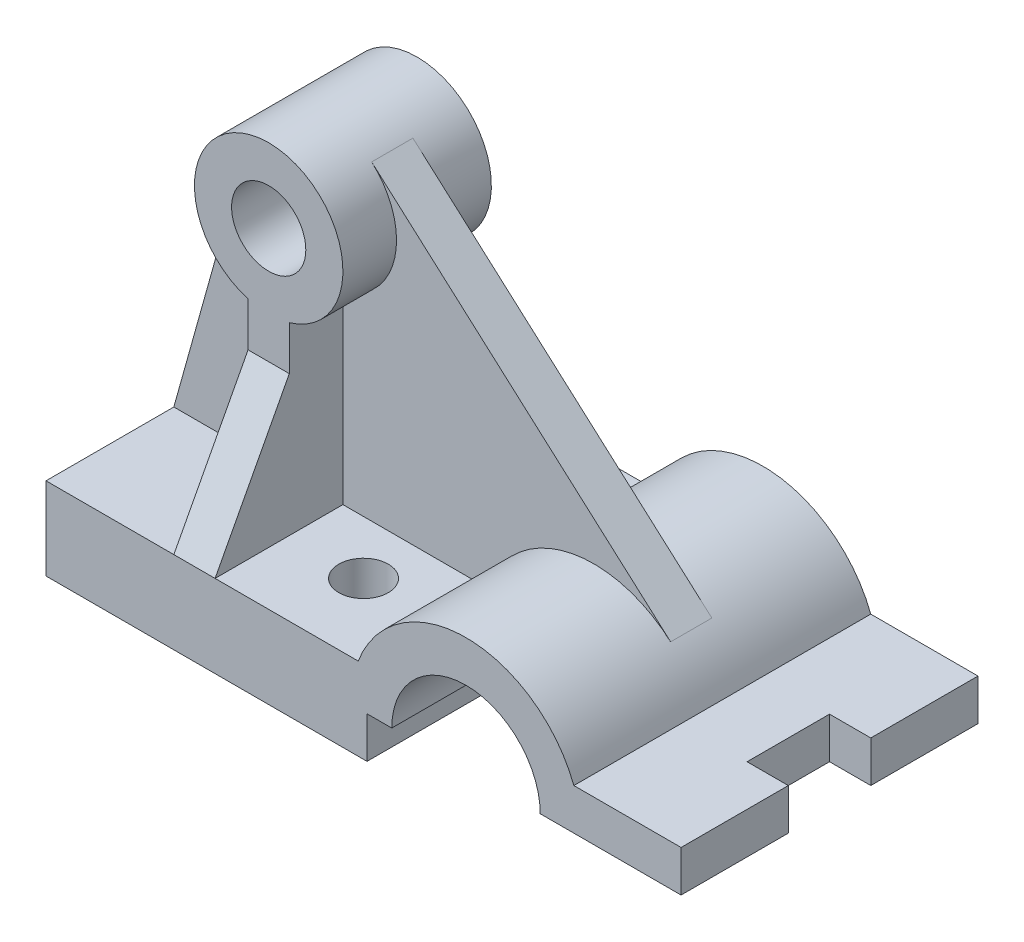
ISO-10303-21;
HEADER;
FILE_DESCRIPTION(('STEP AP214'),'2;1');
FILE_NAME('part.step','',(''),(''),'','','');
FILE_SCHEMA(('AUTOMOTIVE_DESIGN { 1 0 10303 214 1 1 1 1 }'));
ENDSEC;
DATA;
#1=APPLICATION_CONTEXT('core data for automotive mechanical design processes');
#2=APPLICATION_PROTOCOL_DEFINITION('international standard','automotive_design',2000,#1);
#3=PRODUCT_CONTEXT('',#1,'mechanical');
#4=PRODUCT('Part','Part','',(#3));
#5=PRODUCT_RELATED_PRODUCT_CATEGORY('part','',(#4));
#6=PRODUCT_DEFINITION_FORMATION('','',#4);
#7=PRODUCT_DEFINITION_CONTEXT('part definition',#1,'design');
#8=PRODUCT_DEFINITION('design','',#6,#7);
#9=PRODUCT_DEFINITION_SHAPE('','',#8);
#10=(LENGTH_UNIT() NAMED_UNIT(*) SI_UNIT(.MILLI.,.METRE.));
#11=(NAMED_UNIT(*) PLANE_ANGLE_UNIT() SI_UNIT($,.RADIAN.));
#12=(NAMED_UNIT(*) SI_UNIT($,.STERADIAN.) SOLID_ANGLE_UNIT());
#13=UNCERTAINTY_MEASURE_WITH_UNIT(LENGTH_MEASURE(1.E-05),#10,'distance_accuracy_value','');
#14=(GEOMETRIC_REPRESENTATION_CONTEXT(3) GLOBAL_UNCERTAINTY_ASSIGNED_CONTEXT((#13)) GLOBAL_UNIT_ASSIGNED_CONTEXT((#10,
#11,#12)) REPRESENTATION_CONTEXT('',''));
#15=CARTESIAN_POINT('',(0.,0.,0.));
#16=DIRECTION('',(0.,0.,1.));
#17=DIRECTION('',(1.,0.,0.));
#18=AXIS2_PLACEMENT_3D('',#15,#16,#17);
#19=CARTESIAN_POINT('',(0.,20.,-36.));
#20=DIRECTION('',(0.,1.,0.));
#21=DIRECTION('',(-1.,0.,0.));
#22=AXIS2_PLACEMENT_3D('',#19,#20,#21);
#23=PLANE('',#22);
#24=CARTESIAN_POINT('',(59.,20.,-18.));
#25=DIRECTION('',(0.,1.,0.));
#26=DIRECTION('',(1.,0.,0.));
#27=AXIS2_PLACEMENT_3D('',#24,#25,#26);
#28=CIRCLE('',#27,6.);
#29=CARTESIAN_POINT('',(65.,20.,-18.));
#30=VERTEX_POINT('',#29);
#31=EDGE_CURVE('E602',#30,#30,#28,.T.);
#32=ORIENTED_EDGE('',*,*,#31,.F.);
#33=EDGE_LOOP('',(#32));
#34=FACE_BOUND('',#33,.T.);
#35=DIRECTION('',(-1.,0.,0.));
#36=VECTOR('',#35,1.);
#37=CARTESIAN_POINT('',(0.,20.,-36.));
#38=LINE('',#37,#36);
#39=CARTESIAN_POINT('',(75.6932126775119,20.,-36.));
#40=VERTEX_POINT('',#39);
#41=CARTESIAN_POINT('',(41.,20.,-36.));
#42=VERTEX_POINT('',#41);
#43=EDGE_CURVE('E481',#40,#42,#38,.T.);
#44=ORIENTED_EDGE('',*,*,#43,.T.);
#45=DIRECTION('',(0.,0.,1.));
#46=VECTOR('',#45,1.);
#47=CARTESIAN_POINT('',(41.,20.,0.));
#48=LINE('',#47,#46);
#49=CARTESIAN_POINT('',(41.,20.,-5.));
#50=VERTEX_POINT('',#49);
#51=EDGE_CURVE('E264',#42,#50,#48,.T.);
#52=ORIENTED_EDGE('',*,*,#51,.T.);
#53=DIRECTION('',(-1.,0.,0.));
#54=VECTOR('',#53,1.);
#55=CARTESIAN_POINT('',(0.,20.,-5.));
#56=LINE('',#55,#54);
#57=CARTESIAN_POINT('',(75.6932126775119,20.,-5.));
#58=VERTEX_POINT('',#57);
#59=EDGE_CURVE('E405',#58,#50,#56,.T.);
#60=ORIENTED_EDGE('',*,*,#59,.F.);
#61=DIRECTION('',(0.,0.,1.));
#62=VECTOR('',#61,1.);
#63=CARTESIAN_POINT('',(75.6932126775119,20.,-36.));
#64=LINE('',#63,#62);
#65=EDGE_CURVE('E544',#40,#58,#64,.T.);
#66=ORIENTED_EDGE('',*,*,#65,.F.);
#67=EDGE_LOOP('',(#44,#52,#60,#66));
#68=FACE_BOUND('',#67,.T.);
#69=ADVANCED_FACE('F47',(#34,#68),#23,.T.);
#70=CARTESIAN_POINT('',(0.,0.,-5.));
#71=DIRECTION('',(0.,0.,1.));
#72=DIRECTION('',(1.,0.,0.));
#73=AXIS2_PLACEMENT_3D('',#70,#71,#72);
#74=PLANE('',#73);
#75=ORIENTED_EDGE('',*,*,#59,.T.);
#76=DIRECTION('',(0.,1.,0.));
#77=VECTOR('',#76,1.);
#78=CARTESIAN_POINT('',(41.,0.,-5.));
#79=LINE('',#78,#77);
#80=CARTESIAN_POINT('',(41.,64.7083835342094,-5.));
#81=VERTEX_POINT('',#80);
#82=EDGE_CURVE('E388',#50,#81,#79,.T.);
#83=ORIENTED_EDGE('',*,*,#82,.T.);
#84=CARTESIAN_POINT('',(36.,82.,-5.));
#85=DIRECTION('',(0.,0.,1.));
#86=DIRECTION('',(1.,0.,0.));
#87=AXIS2_PLACEMENT_3D('',#84,#85,#86);
#88=CIRCLE('',#87,18.);
#89=CARTESIAN_POINT('',(47.9678846096215,95.4450637027418,-5.));
#90=VERTEX_POINT('',#89);
#91=EDGE_CURVE('E384',#81,#90,#88,.T.);
#92=ORIENTED_EDGE('',*,*,#91,.T.);
#93=DIRECTION('',(0.746947983485653,-0.664882478312308,0.));
#94=VECTOR('',#93,1.);
#95=CARTESIAN_POINT('',(68.6062335357097,77.0742040369626,-5.));
#96=LINE('',#95,#94);
#97=CARTESIAN_POINT('',(120.463315731501,30.9145435375983,-5.));
#98=VERTEX_POINT('',#97);
#99=EDGE_CURVE('E413',#90,#98,#96,.T.);
#100=ORIENTED_EDGE('',*,*,#99,.T.);
#101=CARTESIAN_POINT('',(101.846606338756,10.,-5.));
#102=DIRECTION('',(0.,0.,1.));
#103=DIRECTION('',(1.,0.,0.));
#104=AXIS2_PLACEMENT_3D('',#101,#102,#103);
#105=CIRCLE('',#104,28.);
#106=EDGE_CURVE('E409',#98,#58,#105,.T.);
#107=ORIENTED_EDGE('',*,*,#106,.T.);
#108=EDGE_LOOP('',(#75,#83,#92,#100,#107));
#109=FACE_BOUND('',#108,.T.);
#110=ADVANCED_FACE('F628',(#109),#74,.F.);
#111=CARTESIAN_POINT('',(59.,20.,18.));
#112=DIRECTION('',(0.,1.,0.));
#113=DIRECTION('',(-1.,0.,0.));
#114=AXIS2_PLACEMENT_3D('',#111,#112,#113);
#115=CIRCLE('',#114,6.);
#116=CARTESIAN_POINT('',(53.,20.,18.));
#117=VERTEX_POINT('',#116);
#118=EDGE_CURVE('E606',#117,#117,#115,.T.);
#119=ORIENTED_EDGE('',*,*,#118,.F.);
#120=EDGE_LOOP('',(#119));
#121=FACE_BOUND('',#120,.T.);
#122=DIRECTION('',(-1.,0.,0.));
#123=VECTOR('',#122,1.);
#124=CARTESIAN_POINT('',(0.,20.,5.));
#125=LINE('',#124,#123);
#126=CARTESIAN_POINT('',(75.6932126775119,20.,5.));
#127=VERTEX_POINT('',#126);
#128=CARTESIAN_POINT('',(41.,20.,5.));
#129=VERTEX_POINT('',#128);
#130=EDGE_CURVE('E373',#127,#129,#125,.T.);
#131=ORIENTED_EDGE('',*,*,#130,.T.);
#132=DIRECTION('',(0.,0.,1.));
#133=VECTOR('',#132,1.);
#134=CARTESIAN_POINT('',(41.,20.,0.));
#135=LINE('',#134,#133);
#136=CARTESIAN_POINT('',(41.,20.,36.));
#137=VERTEX_POINT('',#136);
#138=EDGE_CURVE('E276',#137,#129,#135,.F.);
#139=ORIENTED_EDGE('',*,*,#138,.F.);
#140=DIRECTION('',(-1.,0.,0.));
#141=VECTOR('',#140,1.);
#142=CARTESIAN_POINT('',(0.,20.,36.));
#143=LINE('',#142,#141);
#144=CARTESIAN_POINT('',(75.6932126775119,20.,36.));
#145=VERTEX_POINT('',#144);
#146=EDGE_CURVE('E440',#145,#137,#143,.T.);
#147=ORIENTED_EDGE('',*,*,#146,.F.);
#148=EDGE_CURVE('E548',#127,#145,#64,.T.);
#149=ORIENTED_EDGE('',*,*,#148,.F.);
#150=EDGE_LOOP('',(#131,#139,#147,#149));
#151=FACE_BOUND('',#150,.T.);
#152=ADVANCED_FACE('F624',(#121,#151),#23,.T.);
#153=CARTESIAN_POINT('',(0.,0.,5.));
#154=DIRECTION('',(0.,0.,1.));
#155=DIRECTION('',(1.,0.,0.));
#156=AXIS2_PLACEMENT_3D('',#153,#154,#155);
#157=PLANE('',#156);
#158=DIRECTION('',(0.,1.,0.));
#159=VECTOR('',#158,1.);
#160=CARTESIAN_POINT('',(41.,0.,5.));
#161=LINE('',#160,#159);
#162=CARTESIAN_POINT('',(41.,64.7083835342094,5.));
#163=VERTEX_POINT('',#162);
#164=EDGE_CURVE('E357',#129,#163,#161,.T.);
#165=ORIENTED_EDGE('',*,*,#164,.F.);
#166=ORIENTED_EDGE('',*,*,#130,.F.);
#167=CARTESIAN_POINT('',(101.846606338756,10.,5.));
#168=DIRECTION('',(0.,0.,1.));
#169=DIRECTION('',(1.,0.,0.));
#170=AXIS2_PLACEMENT_3D('',#167,#168,#169);
#171=CIRCLE('',#170,28.);
#172=CARTESIAN_POINT('',(120.463315731501,30.9145435375983,5.));
#173=VERTEX_POINT('',#172);
#174=EDGE_CURVE('E377',#173,#127,#171,.T.);
#175=ORIENTED_EDGE('',*,*,#174,.F.);
#176=DIRECTION('',(0.746947983485653,-0.664882478312308,0.));
#177=VECTOR('',#176,1.);
#178=CARTESIAN_POINT('',(68.6062335357097,77.0742040369626,5.));
#179=LINE('',#178,#177);
#180=CARTESIAN_POINT('',(47.9678846096215,95.4450637027418,5.));
#181=VERTEX_POINT('',#180);
#182=EDGE_CURVE('E380',#181,#173,#179,.T.);
#183=ORIENTED_EDGE('',*,*,#182,.F.);
#184=CARTESIAN_POINT('',(36.,82.,5.));
#185=DIRECTION('',(0.,0.,1.));
#186=DIRECTION('',(1.,0.,0.));
#187=AXIS2_PLACEMENT_3D('',#184,#185,#186);
#188=CIRCLE('',#187,18.);
#189=EDGE_CURVE('E349',#163,#181,#188,.T.);
#190=ORIENTED_EDGE('',*,*,#189,.F.);
#191=EDGE_LOOP('',(#165,#166,#175,#183,#190));
#192=FACE_BOUND('',#191,.T.);
#193=ADVANCED_FACE('F627',(#192),#157,.T.);
#194=CARTESIAN_POINT('',(154.,0.,-36.));
#195=DIRECTION('',(1.,0.,0.));
#196=DIRECTION('',(0.,0.,-1.));
#197=AXIS2_PLACEMENT_3D('',#194,#195,#196);
#198=PLANE('',#197);
#199=DIRECTION('',(0.,1.,0.));
#200=VECTOR('',#199,1.);
#201=CARTESIAN_POINT('',(154.,0.,-10.));
#202=LINE('',#201,#200);
#203=CARTESIAN_POINT('',(154.,10.,-10.));
#204=VERTEX_POINT('',#203);
#205=CARTESIAN_POINT('',(154.,20.,-10.));
#206=VERTEX_POINT('',#205);
#207=EDGE_CURVE('E310',#204,#206,#202,.T.);
#208=ORIENTED_EDGE('',*,*,#207,.F.);
#209=DIRECTION('',(0.,0.,1.));
#210=VECTOR('',#209,1.);
#211=CARTESIAN_POINT('',(154.,10.,-36.));
#212=LINE('',#211,#210);
#213=CARTESIAN_POINT('',(154.,10.,-36.));
#214=VERTEX_POINT('',#213);
#215=EDGE_CURVE('E519',#214,#204,#212,.T.);
#216=ORIENTED_EDGE('',*,*,#215,.F.);
#217=DIRECTION('',(0.,1.,0.));
#218=VECTOR('',#217,1.);
#219=CARTESIAN_POINT('',(154.,0.,-36.));
#220=LINE('',#219,#218);
#221=CARTESIAN_POINT('',(154.,20.,-36.));
#222=VERTEX_POINT('',#221);
#223=EDGE_CURVE('E508',#214,#222,#220,.T.);
#224=ORIENTED_EDGE('',*,*,#223,.T.);
#225=DIRECTION('',(0.,0.,1.));
#226=VECTOR('',#225,1.);
#227=CARTESIAN_POINT('',(154.,20.,-36.));
#228=LINE('',#227,#226);
#229=EDGE_CURVE('E513',#222,#206,#228,.T.);
#230=ORIENTED_EDGE('',*,*,#229,.T.);
#231=EDGE_LOOP('',(#208,#216,#224,#230));
#232=FACE_BOUND('',#231,.T.);
#233=ADVANCED_FACE('F570',(#232),#198,.T.);
#234=DIRECTION('',(0.,0.,1.));
#235=VECTOR('',#234,1.);
#236=CARTESIAN_POINT('',(31.,20.,0.));
#237=LINE('',#236,#235);
#238=CARTESIAN_POINT('',(31.,20.,-36.));
#239=VERTEX_POINT('',#238);
#240=CARTESIAN_POINT('',(31.,20.,-5.));
#241=VERTEX_POINT('',#240);
#242=EDGE_CURVE('E63',#239,#241,#237,.T.);
#243=ORIENTED_EDGE('',*,*,#242,.F.);
#244=CARTESIAN_POINT('',(0.,20.,-36.));
#245=VERTEX_POINT('',#244);
#246=EDGE_CURVE('E480',#239,#245,#38,.T.);
#247=ORIENTED_EDGE('',*,*,#246,.T.);
#248=DIRECTION('',(0.,0.,1.));
#249=VECTOR('',#248,1.);
#250=CARTESIAN_POINT('',(0.,20.,-36.));
#251=LINE('',#250,#249);
#252=CARTESIAN_POINT('',(0.,20.,-5.));
#253=VERTEX_POINT('',#252);
#254=EDGE_CURVE('E539',#245,#253,#251,.T.);
#255=ORIENTED_EDGE('',*,*,#254,.T.);
#256=EDGE_CURVE('E404',#241,#253,#56,.T.);
#257=ORIENTED_EDGE('',*,*,#256,.F.);
#258=EDGE_LOOP('',(#243,#247,#255,#257));
#259=FACE_BOUND('',#258,.T.);
#260=ADVANCED_FACE('F630',(#259),#23,.T.);
#261=CARTESIAN_POINT('',(101.846606338756,10.,-36.));
#262=DIRECTION('',(0.,0.,1.));
#263=DIRECTION('',(1.,0.,0.));
#264=AXIS2_PLACEMENT_3D('',#261,#262,#263);
#265=CYLINDRICAL_SURFACE('',#264,28.);
#266=ORIENTED_EDGE('',*,*,#65,.T.);
#267=ORIENTED_EDGE('',*,*,#106,.F.);
#268=DIRECTION('',(0.,0.,1.));
#269=VECTOR('',#268,1.);
#270=CARTESIAN_POINT('',(120.463315731501,30.9145435375983,-5.));
#271=LINE('',#270,#269);
#272=EDGE_CURVE('E422',#98,#173,#271,.T.);
#273=ORIENTED_EDGE('',*,*,#272,.T.);
#274=ORIENTED_EDGE('',*,*,#174,.T.);
#275=ORIENTED_EDGE('',*,*,#148,.T.);
#276=CARTESIAN_POINT('',(101.846606338756,10.,36.));
#277=DIRECTION('',(0.,0.,1.));
#278=DIRECTION('',(1.,0.,0.));
#279=AXIS2_PLACEMENT_3D('',#276,#277,#278);
#280=CIRCLE('',#279,28.);
#281=CARTESIAN_POINT('',(128.,20.,36.));
#282=VERTEX_POINT('',#281);
#283=EDGE_CURVE('E435',#282,#145,#280,.T.);
#284=ORIENTED_EDGE('',*,*,#283,.F.);
#285=DIRECTION('',(0.,0.,1.));
#286=VECTOR('',#285,1.);
#287=CARTESIAN_POINT('',(128.,20.,-36.));
#288=LINE('',#287,#286);
#289=CARTESIAN_POINT('',(128.,20.,-36.));
#290=VERTEX_POINT('',#289);
#291=EDGE_CURVE('E512',#290,#282,#288,.T.);
#292=ORIENTED_EDGE('',*,*,#291,.F.);
#293=CARTESIAN_POINT('',(101.846606338756,10.,-36.));
#294=DIRECTION('',(0.,0.,1.));
#295=DIRECTION('',(1.,0.,0.));
#296=AXIS2_PLACEMENT_3D('',#293,#294,#295);
#297=CIRCLE('',#296,28.);
#298=EDGE_CURVE('E476',#290,#40,#297,.T.);
#299=ORIENTED_EDGE('',*,*,#298,.T.);
#300=EDGE_LOOP('',(#266,#267,#273,#274,#275,#284,#292,#299));
#301=FACE_BOUND('',#300,.T.);
#302=ADVANCED_FACE('F652',(#301),#265,.T.);
#303=CARTESIAN_POINT('',(0.,20.,-36.));
#304=DIRECTION('',(0.,1.,0.));
#305=DIRECTION('',(-1.,0.,0.));
#306=AXIS2_PLACEMENT_3D('',#303,#304,#305);
#307=PLANE('',#306);
#308=DIRECTION('',(-1.,0.,0.));
#309=VECTOR('',#308,1.);
#310=CARTESIAN_POINT('',(144.,20.,-9.99999999999999));
#311=LINE('',#310,#309);
#312=CARTESIAN_POINT('',(144.,20.,-9.99999999999999));
#313=VERTEX_POINT('',#312);
#314=EDGE_CURVE('E301',#206,#313,#311,.T.);
#315=ORIENTED_EDGE('',*,*,#314,.F.);
#316=ORIENTED_EDGE('',*,*,#229,.F.);
#317=DIRECTION('',(-1.,0.,0.));
#318=VECTOR('',#317,1.);
#319=CARTESIAN_POINT('',(0.,20.,-36.));
#320=LINE('',#319,#318);
#321=EDGE_CURVE('E472',#222,#290,#320,.T.);
#322=ORIENTED_EDGE('',*,*,#321,.T.);
#323=ORIENTED_EDGE('',*,*,#291,.T.);
#324=DIRECTION('',(-1.,0.,0.));
#325=VECTOR('',#324,1.);
#326=CARTESIAN_POINT('',(0.,20.,36.));
#327=LINE('',#326,#325);
#328=CARTESIAN_POINT('',(154.,20.,36.));
#329=VERTEX_POINT('',#328);
#330=EDGE_CURVE('E421',#329,#282,#327,.T.);
#331=ORIENTED_EDGE('',*,*,#330,.F.);
#332=CARTESIAN_POINT('',(154.,20.,10.));
#333=VERTEX_POINT('',#332);
#334=EDGE_CURVE('E518',#333,#329,#228,.T.);
#335=ORIENTED_EDGE('',*,*,#334,.F.);
#336=DIRECTION('',(1.,0.,0.));
#337=VECTOR('',#336,1.);
#338=CARTESIAN_POINT('',(144.,20.,9.99999999999999));
#339=LINE('',#338,#337);
#340=CARTESIAN_POINT('',(144.,20.,9.99999999999999));
#341=VERTEX_POINT('',#340);
#342=EDGE_CURVE('E298',#341,#333,#339,.T.);
#343=ORIENTED_EDGE('',*,*,#342,.F.);
#344=DIRECTION('',(0.,0.,1.));
#345=VECTOR('',#344,1.);
#346=CARTESIAN_POINT('',(144.,20.,-9.99999999999999));
#347=LINE('',#346,#345);
#348=EDGE_CURVE('E294',#313,#341,#347,.T.);
#349=ORIENTED_EDGE('',*,*,#348,.F.);
#350=EDGE_LOOP('',(#315,#316,#322,#323,#331,#335,#343,#349));
#351=FACE_BOUND('',#350,.T.);
#352=ADVANCED_FACE('F49',(#351),#307,.T.);
#353=DIRECTION('',(0.,1.,0.));
#354=VECTOR('',#353,1.);
#355=CARTESIAN_POINT('',(154.,0.,10.));
#356=LINE('',#355,#354);
#357=CARTESIAN_POINT('',(154.,10.,10.));
#358=VERTEX_POINT('',#357);
#359=EDGE_CURVE('E313',#358,#333,#356,.T.);
#360=ORIENTED_EDGE('',*,*,#359,.T.);
#361=ORIENTED_EDGE('',*,*,#334,.T.);
#362=DIRECTION('',(0.,1.,0.));
#363=VECTOR('',#362,1.);
#364=CARTESIAN_POINT('',(154.,0.,36.));
#365=LINE('',#364,#363);
#366=CARTESIAN_POINT('',(154.,10.,36.));
#367=VERTEX_POINT('',#366);
#368=EDGE_CURVE('E468',#367,#329,#365,.T.);
#369=ORIENTED_EDGE('',*,*,#368,.F.);
#370=EDGE_CURVE('E523',#358,#367,#212,.T.);
#371=ORIENTED_EDGE('',*,*,#370,.F.);
#372=EDGE_LOOP('',(#360,#361,#369,#371));
#373=FACE_BOUND('',#372,.T.);
#374=ADVANCED_FACE('F580',(#373),#198,.T.);
#375=CARTESIAN_POINT('',(0.,9.99999999999998,-36.));
#376=DIRECTION('',(0.,-1.,0.));
#377=DIRECTION('',(1.,0.,0.));
#378=AXIS2_PLACEMENT_3D('',#375,#376,#377);
#379=PLANE('',#378);
#380=DIRECTION('',(1.,0.,0.));
#381=VECTOR('',#380,1.);
#382=CARTESIAN_POINT('',(0.,9.99999999999998,-9.99999999999979));
#383=LINE('',#382,#381);
#384=CARTESIAN_POINT('',(144.,10.,-9.99999999999999));
#385=VERTEX_POINT('',#384);
#386=EDGE_CURVE('E11',#385,#204,#383,.T.);
#387=ORIENTED_EDGE('',*,*,#386,.F.);
#388=DIRECTION('',(0.,0.,-1.));
#389=VECTOR('',#388,1.);
#390=CARTESIAN_POINT('',(144.,10.,-36.));
#391=LINE('',#390,#389);
#392=CARTESIAN_POINT('',(144.,10.,9.99999999999999));
#393=VERTEX_POINT('',#392);
#394=EDGE_CURVE('E56',#393,#385,#391,.T.);
#395=ORIENTED_EDGE('',*,*,#394,.F.);
#396=DIRECTION('',(-1.,0.,0.));
#397=VECTOR('',#396,1.);
#398=CARTESIAN_POINT('',(0.,9.99999999999998,9.9999999999999));
#399=LINE('',#398,#397);
#400=EDGE_CURVE('E517',#358,#393,#399,.T.);
#401=ORIENTED_EDGE('',*,*,#400,.F.);
#402=ORIENTED_EDGE('',*,*,#370,.T.);
#403=DIRECTION('',(1.,0.,0.));
#404=VECTOR('',#403,1.);
#405=CARTESIAN_POINT('',(0.,9.99999999999998,36.));
#406=LINE('',#405,#404);
#407=CARTESIAN_POINT('',(119.846606338756,10.,36.));
#408=VERTEX_POINT('',#407);
#409=EDGE_CURVE('E464',#408,#367,#406,.T.);
#410=ORIENTED_EDGE('',*,*,#409,.F.);
#411=DIRECTION('',(0.,0.,1.));
#412=VECTOR('',#411,1.);
#413=CARTESIAN_POINT('',(119.846606338756,10.,-36.));
#414=LINE('',#413,#412);
#415=CARTESIAN_POINT('',(119.846606338756,10.,-36.));
#416=VERTEX_POINT('',#415);
#417=EDGE_CURVE('E524',#416,#408,#414,.T.);
#418=ORIENTED_EDGE('',*,*,#417,.F.);
#419=DIRECTION('',(1.,0.,0.));
#420=VECTOR('',#419,1.);
#421=CARTESIAN_POINT('',(0.,9.99999999999998,-36.));
#422=LINE('',#421,#420);
#423=EDGE_CURVE('E504',#416,#214,#422,.T.);
#424=ORIENTED_EDGE('',*,*,#423,.T.);
#425=ORIENTED_EDGE('',*,*,#215,.T.);
#426=EDGE_LOOP('',(#387,#395,#401,#402,#410,#418,#424,#425));
#427=FACE_BOUND('',#426,.T.);
#428=ADVANCED_FACE('F566',(#427),#379,.T.);
#429=CARTESIAN_POINT('',(101.846606338756,10.,-36.));
#430=DIRECTION('',(0.,0.,1.));
#431=DIRECTION('',(1.,0.,0.));
#432=AXIS2_PLACEMENT_3D('',#429,#430,#431);
#433=CYLINDRICAL_SURFACE('',#432,18.);
#434=ORIENTED_EDGE('',*,*,#417,.T.);
#435=CARTESIAN_POINT('',(101.846606338756,10.,36.));
#436=DIRECTION('',(0.,0.,1.));
#437=DIRECTION('',(1.,0.,0.));
#438=AXIS2_PLACEMENT_3D('',#435,#436,#437);
#439=CIRCLE('',#438,18.);
#440=CARTESIAN_POINT('',(83.846606338756,9.99999999999999,36.));
#441=VERTEX_POINT('',#440);
#442=EDGE_CURVE('E460',#441,#408,#439,.F.);
#443=ORIENTED_EDGE('',*,*,#442,.F.);
#444=DIRECTION('',(0.,0.,1.));
#445=VECTOR('',#444,1.);
#446=CARTESIAN_POINT('',(83.846606338756,9.99999999999999,-36.));
#447=LINE('',#446,#445);
#448=CARTESIAN_POINT('',(83.846606338756,9.99999999999999,-36.));
#449=VERTEX_POINT('',#448);
#450=EDGE_CURVE('E527',#449,#441,#447,.T.);
#451=ORIENTED_EDGE('',*,*,#450,.F.);
#452=CARTESIAN_POINT('',(101.846606338756,10.,-36.));
#453=DIRECTION('',(0.,0.,1.));
#454=DIRECTION('',(1.,0.,0.));
#455=AXIS2_PLACEMENT_3D('',#452,#453,#454);
#456=CIRCLE('',#455,18.);
#457=EDGE_CURVE('E500',#449,#416,#456,.F.);
#458=ORIENTED_EDGE('',*,*,#457,.T.);
#459=EDGE_LOOP('',(#434,#443,#451,#458));
#460=FACE_BOUND('',#459,.T.);
#461=ADVANCED_FACE('F692',(#460),#433,.F.);
#462=CARTESIAN_POINT('',(0.,9.99999999999999,-36.));
#463=DIRECTION('',(0.,-1.,0.));
#464=DIRECTION('',(0.,0.,-1.));
#465=AXIS2_PLACEMENT_3D('',#462,#463,#464);
#466=PLANE('',#465);
#467=ORIENTED_EDGE('',*,*,#450,.T.);
#468=DIRECTION('',(1.,0.,0.));
#469=VECTOR('',#468,1.);
#470=CARTESIAN_POINT('',(0.,9.99999999999999,36.));
#471=LINE('',#470,#469);
#472=CARTESIAN_POINT('',(77.846606338756,9.99999999999999,36.));
#473=VERTEX_POINT('',#472);
#474=EDGE_CURVE('E456',#473,#441,#471,.T.);
#475=ORIENTED_EDGE('',*,*,#474,.F.);
#476=DIRECTION('',(0.,0.,1.));
#477=VECTOR('',#476,1.);
#478=CARTESIAN_POINT('',(77.846606338756,9.99999999999999,-36.));
#479=LINE('',#478,#477);
#480=CARTESIAN_POINT('',(77.846606338756,9.99999999999999,-36.));
#481=VERTEX_POINT('',#480);
#482=EDGE_CURVE('E530',#481,#473,#479,.T.);
#483=ORIENTED_EDGE('',*,*,#482,.F.);
#484=DIRECTION('',(1.,0.,0.));
#485=VECTOR('',#484,1.);
#486=CARTESIAN_POINT('',(0.,9.99999999999999,-36.));
#487=LINE('',#486,#485);
#488=EDGE_CURVE('E496',#481,#449,#487,.T.);
#489=ORIENTED_EDGE('',*,*,#488,.T.);
#490=EDGE_LOOP('',(#467,#475,#483,#489));
#491=FACE_BOUND('',#490,.T.);
#492=ADVANCED_FACE('F688',(#491),#466,.T.);
#493=CARTESIAN_POINT('',(77.846606338756,0.,-36.));
#494=DIRECTION('',(1.,0.,0.));
#495=DIRECTION('',(0.,0.,-1.));
#496=AXIS2_PLACEMENT_3D('',#493,#494,#495);
#497=PLANE('',#496);
#498=ORIENTED_EDGE('',*,*,#482,.T.);
#499=DIRECTION('',(0.,1.,0.));
#500=VECTOR('',#499,1.);
#501=CARTESIAN_POINT('',(77.846606338756,0.,36.));
#502=LINE('',#501,#500);
#503=CARTESIAN_POINT('',(77.846606338756,0.,36.));
#504=VERTEX_POINT('',#503);
#505=EDGE_CURVE('E452',#504,#473,#502,.T.);
#506=ORIENTED_EDGE('',*,*,#505,.F.);
#507=DIRECTION('',(0.,0.,1.));
#508=VECTOR('',#507,1.);
#509=CARTESIAN_POINT('',(77.846606338756,0.,-36.));
#510=LINE('',#509,#508);
#511=CARTESIAN_POINT('',(77.846606338756,0.,-36.));
#512=VERTEX_POINT('',#511);
#513=EDGE_CURVE('E533',#512,#504,#510,.T.);
#514=ORIENTED_EDGE('',*,*,#513,.F.);
#515=DIRECTION('',(0.,1.,0.));
#516=VECTOR('',#515,1.);
#517=CARTESIAN_POINT('',(77.846606338756,0.,-36.));
#518=LINE('',#517,#516);
#519=EDGE_CURVE('E492',#512,#481,#518,.T.);
#520=ORIENTED_EDGE('',*,*,#519,.T.);
#521=EDGE_LOOP('',(#498,#506,#514,#520));
#522=FACE_BOUND('',#521,.T.);
#523=ADVANCED_FACE('F682',(#522),#497,.T.);
#524=CARTESIAN_POINT('',(0.,0.,-36.));
#525=DIRECTION('',(0.,-1.,0.));
#526=DIRECTION('',(1.,0.,0.));
#527=AXIS2_PLACEMENT_3D('',#524,#525,#526);
#528=PLANE('',#527);
#529=CARTESIAN_POINT('',(59.,0.,18.));
#530=DIRECTION('',(0.,1.,0.));
#531=DIRECTION('',(-1.,0.,0.));
#532=AXIS2_PLACEMENT_3D('',#529,#530,#531);
#533=CIRCLE('',#532,6.);
#534=CARTESIAN_POINT('',(53.,0.,18.));
#535=VERTEX_POINT('',#534);
#536=EDGE_CURVE('E270',#535,#535,#533,.T.);
#537=ORIENTED_EDGE('',*,*,#536,.T.);
#538=EDGE_LOOP('',(#537));
#539=FACE_BOUND('',#538,.T.);
#540=CARTESIAN_POINT('',(59.,0.,-18.));
#541=DIRECTION('',(0.,1.,0.));
#542=DIRECTION('',(1.,0.,0.));
#543=AXIS2_PLACEMENT_3D('',#540,#541,#542);
#544=CIRCLE('',#543,6.);
#545=CARTESIAN_POINT('',(65.,0.,-18.));
#546=VERTEX_POINT('',#545);
#547=EDGE_CURVE('E598',#546,#546,#544,.T.);
#548=ORIENTED_EDGE('',*,*,#547,.T.);
#549=EDGE_LOOP('',(#548));
#550=FACE_BOUND('',#549,.T.);
#551=ORIENTED_EDGE('',*,*,#513,.T.);
#552=DIRECTION('',(1.,0.,0.));
#553=VECTOR('',#552,1.);
#554=CARTESIAN_POINT('',(0.,0.,36.));
#555=LINE('',#554,#553);
#556=CARTESIAN_POINT('',(0.,0.,36.));
#557=VERTEX_POINT('',#556);
#558=EDGE_CURVE('E448',#557,#504,#555,.T.);
#559=ORIENTED_EDGE('',*,*,#558,.F.);
#560=DIRECTION('',(0.,0.,1.));
#561=VECTOR('',#560,1.);
#562=CARTESIAN_POINT('',(0.,0.,-36.));
#563=LINE('',#562,#561);
#564=CARTESIAN_POINT('',(0.,0.,-36.));
#565=VERTEX_POINT('',#564);
#566=EDGE_CURVE('E536',#565,#557,#563,.T.);
#567=ORIENTED_EDGE('',*,*,#566,.F.);
#568=DIRECTION('',(1.,0.,0.));
#569=VECTOR('',#568,1.);
#570=CARTESIAN_POINT('',(0.,0.,-36.));
#571=LINE('',#570,#569);
#572=EDGE_CURVE('E488',#565,#512,#571,.T.);
#573=ORIENTED_EDGE('',*,*,#572,.T.);
#574=EDGE_LOOP('',(#551,#559,#567,#573));
#575=FACE_BOUND('',#574,.T.);
#576=ADVANCED_FACE('F614',(#539,#550,#575),#528,.T.);
#577=CARTESIAN_POINT('',(0.,0.,-36.));
#578=DIRECTION('',(-1.,0.,0.));
#579=DIRECTION('',(0.,-1.,0.));
#580=AXIS2_PLACEMENT_3D('',#577,#578,#579);
#581=PLANE('',#580);
#582=ORIENTED_EDGE('',*,*,#566,.T.);
#583=DIRECTION('',(0.,-1.,0.));
#584=VECTOR('',#583,1.);
#585=CARTESIAN_POINT('',(0.,0.,36.));
#586=LINE('',#585,#584);
#587=CARTESIAN_POINT('',(0.,20.,36.));
#588=VERTEX_POINT('',#587);
#589=EDGE_CURVE('E444',#588,#557,#586,.T.);
#590=ORIENTED_EDGE('',*,*,#589,.F.);
#591=CARTESIAN_POINT('',(0.,20.,5.));
#592=VERTEX_POINT('',#591);
#593=EDGE_CURVE('E543',#592,#588,#251,.T.);
#594=ORIENTED_EDGE('',*,*,#593,.F.);
#595=DIRECTION('',(0.,0.,1.));
#596=VECTOR('',#595,1.);
#597=CARTESIAN_POINT('',(0.,20.,-5.));
#598=LINE('',#597,#596);
#599=EDGE_CURVE('E425',#253,#592,#598,.T.);
#600=ORIENTED_EDGE('',*,*,#599,.F.);
#601=ORIENTED_EDGE('',*,*,#254,.F.);
#602=DIRECTION('',(0.,-1.,0.));
#603=VECTOR('',#602,1.);
#604=CARTESIAN_POINT('',(0.,0.,-36.));
#605=LINE('',#604,#603);
#606=EDGE_CURVE('E484',#245,#565,#605,.T.);
#607=ORIENTED_EDGE('',*,*,#606,.T.);
#608=EDGE_LOOP('',(#582,#590,#594,#600,#601,#607));
#609=FACE_BOUND('',#608,.T.);
#610=ADVANCED_FACE('F675',(#609),#581,.T.);
#611=DIRECTION('',(0.,0.,1.));
#612=VECTOR('',#611,1.);
#613=CARTESIAN_POINT('',(31.,20.,0.));
#614=LINE('',#613,#612);
#615=CARTESIAN_POINT('',(31.,20.,36.));
#616=VERTEX_POINT('',#615);
#617=CARTESIAN_POINT('',(31.,20.,5.));
#618=VERTEX_POINT('',#617);
#619=EDGE_CURVE('E281',#616,#618,#614,.F.);
#620=ORIENTED_EDGE('',*,*,#619,.T.);
#621=EDGE_CURVE('E372',#618,#592,#125,.T.);
#622=ORIENTED_EDGE('',*,*,#621,.T.);
#623=ORIENTED_EDGE('',*,*,#593,.T.);
#624=EDGE_CURVE('E439',#616,#588,#143,.T.);
#625=ORIENTED_EDGE('',*,*,#624,.F.);
#626=EDGE_LOOP('',(#620,#622,#623,#625));
#627=FACE_BOUND('',#626,.T.);
#628=ADVANCED_FACE('F670',(#627),#23,.T.);
#629=CARTESIAN_POINT('',(0.,0.,-36.));
#630=DIRECTION('',(0.,0.,1.));
#631=DIRECTION('',(1.,0.,0.));
#632=AXIS2_PLACEMENT_3D('',#629,#630,#631);
#633=PLANE('',#632);
#634=ORIENTED_EDGE('',*,*,#321,.F.);
#635=ORIENTED_EDGE('',*,*,#223,.F.);
#636=ORIENTED_EDGE('',*,*,#423,.F.);
#637=ORIENTED_EDGE('',*,*,#457,.F.);
#638=ORIENTED_EDGE('',*,*,#488,.F.);
#639=ORIENTED_EDGE('',*,*,#519,.F.);
#640=ORIENTED_EDGE('',*,*,#572,.F.);
#641=ORIENTED_EDGE('',*,*,#606,.F.);
#642=ORIENTED_EDGE('',*,*,#246,.F.);
#643=DIRECTION('',(-1.,0.,0.));
#644=VECTOR('',#643,1.);
#645=CARTESIAN_POINT('',(36.,20.,-36.));
#646=LINE('',#645,#644);
#647=EDGE_CURVE('E70',#42,#239,#646,.T.);
#648=ORIENTED_EDGE('',*,*,#647,.F.);
#649=ORIENTED_EDGE('',*,*,#43,.F.);
#650=ORIENTED_EDGE('',*,*,#298,.F.);
#651=EDGE_LOOP('',(#634,#635,#636,#637,#638,#639,#640,#641,#642,#648,#649,#650));
#652=FACE_BOUND('',#651,.T.);
#653=ADVANCED_FACE('F684',(#652),#633,.F.);
#654=CARTESIAN_POINT('',(0.,0.,36.));
#655=DIRECTION('',(0.,0.,1.));
#656=DIRECTION('',(1.,0.,0.));
#657=AXIS2_PLACEMENT_3D('',#654,#655,#656);
#658=PLANE('',#657);
#659=ORIENTED_EDGE('',*,*,#330,.T.);
#660=ORIENTED_EDGE('',*,*,#283,.T.);
#661=ORIENTED_EDGE('',*,*,#146,.T.);
#662=DIRECTION('',(-1.,0.,0.));
#663=VECTOR('',#662,1.);
#664=CARTESIAN_POINT('',(36.,20.,36.));
#665=LINE('',#664,#663);
#666=EDGE_CURVE('E280',#137,#616,#665,.T.);
#667=ORIENTED_EDGE('',*,*,#666,.T.);
#668=ORIENTED_EDGE('',*,*,#624,.T.);
#669=ORIENTED_EDGE('',*,*,#589,.T.);
#670=ORIENTED_EDGE('',*,*,#558,.T.);
#671=ORIENTED_EDGE('',*,*,#505,.T.);
#672=ORIENTED_EDGE('',*,*,#474,.T.);
#673=ORIENTED_EDGE('',*,*,#442,.T.);
#674=ORIENTED_EDGE('',*,*,#409,.T.);
#675=ORIENTED_EDGE('',*,*,#368,.T.);
#676=EDGE_LOOP('',(#659,#660,#661,#667,#668,#669,#670,#671,#672,#673,#674,#675));
#677=FACE_BOUND('',#676,.T.);
#678=ADVANCED_FACE('F648',(#677),#658,.T.);
#679=CARTESIAN_POINT('',(68.6062335357097,77.0742040369626,-5.));
#680=DIRECTION('',(-0.664882478312308,-0.746947983485653,0.));
#681=DIRECTION('',(0.746947983485653,-0.664882478312308,0.));
#682=AXIS2_PLACEMENT_3D('',#679,#680,#681);
#683=PLANE('',#682);
#684=DIRECTION('',(0.,0.,1.));
#685=VECTOR('',#684,1.);
#686=CARTESIAN_POINT('',(47.9678846096215,95.4450637027418,-5.));
#687=LINE('',#686,#685);
#688=EDGE_CURVE('E418',#90,#181,#687,.T.);
#689=ORIENTED_EDGE('',*,*,#688,.T.);
#690=ORIENTED_EDGE('',*,*,#182,.T.);
#691=ORIENTED_EDGE('',*,*,#272,.F.);
#692=ORIENTED_EDGE('',*,*,#99,.F.);
#693=EDGE_LOOP('',(#689,#690,#691,#692));
#694=FACE_BOUND('',#693,.T.);
#695=ADVANCED_FACE('F656',(#694),#683,.F.);
#696=CARTESIAN_POINT('',(-5.18047310166884,1.44648034766474,-5.));
#697=DIRECTION('',(-0.963159375501668,0.268931250291291,0.));
#698=DIRECTION('',(-0.268931250291291,-0.963159375501668,0.));
#699=AXIS2_PLACEMENT_3D('',#696,#697,#698);
#700=PLANE('',#699);
#701=ORIENTED_EDGE('',*,*,#599,.T.);
#702=DIRECTION('',(-0.268931250291291,-0.963159375501668,0.));
#703=VECTOR('',#702,1.);
#704=CARTESIAN_POINT('',(-5.18047310166884,1.44648034766474,5.));
#705=LINE('',#704,#703);
#706=CARTESIAN_POINT('',(18.66313124097,86.8407625052432,5.));
#707=VERTEX_POINT('',#706);
#708=EDGE_CURVE('E368',#707,#592,#705,.T.);
#709=ORIENTED_EDGE('',*,*,#708,.F.);
#710=DIRECTION('',(0.,0.,1.));
#711=VECTOR('',#710,1.);
#712=CARTESIAN_POINT('',(18.66313124097,86.8407625052432,-5.));
#713=LINE('',#712,#711);
#714=CARTESIAN_POINT('',(18.66313124097,86.8407625052432,-5.));
#715=VERTEX_POINT('',#714);
#716=EDGE_CURVE('E417',#715,#707,#713,.T.);
#717=ORIENTED_EDGE('',*,*,#716,.F.);
#718=DIRECTION('',(-0.268931250291291,-0.963159375501668,0.));
#719=VECTOR('',#718,1.);
#720=CARTESIAN_POINT('',(-5.18047310166884,1.44648034766474,-5.));
#721=LINE('',#720,#719);
#722=EDGE_CURVE('E400',#715,#253,#721,.T.);
#723=ORIENTED_EDGE('',*,*,#722,.T.);
#724=EDGE_LOOP('',(#701,#709,#717,#723));
#725=FACE_BOUND('',#724,.T.);
#726=ADVANCED_FACE('F889',(#725),#700,.T.);
#727=DIRECTION('',(0.,1.,0.));
#728=VECTOR('',#727,1.);
#729=CARTESIAN_POINT('',(31.,0.,-5.));
#730=LINE('',#729,#728);
#731=CARTESIAN_POINT('',(31.,64.7083835342094,-5.));
#732=VERTEX_POINT('',#731);
#733=EDGE_CURVE('E392',#241,#732,#730,.T.);
#734=ORIENTED_EDGE('',*,*,#733,.F.);
#735=ORIENTED_EDGE('',*,*,#256,.T.);
#736=ORIENTED_EDGE('',*,*,#722,.F.);
#737=CARTESIAN_POINT('',(36.,82.,-5.));
#738=DIRECTION('',(0.,0.,1.));
#739=DIRECTION('',(1.,0.,0.));
#740=AXIS2_PLACEMENT_3D('',#737,#738,#739);
#741=CIRCLE('',#740,18.);
#742=EDGE_CURVE('E396',#715,#732,#741,.T.);
#743=ORIENTED_EDGE('',*,*,#742,.T.);
#744=EDGE_LOOP('',(#734,#735,#736,#743));
#745=FACE_BOUND('',#744,.T.);
#746=ADVANCED_FACE('F702',(#745),#74,.F.);
#747=ORIENTED_EDGE('',*,*,#621,.F.);
#748=DIRECTION('',(0.,1.,0.));
#749=VECTOR('',#748,1.);
#750=CARTESIAN_POINT('',(31.,0.,5.));
#751=LINE('',#750,#749);
#752=CARTESIAN_POINT('',(31.,64.7083835342094,5.));
#753=VERTEX_POINT('',#752);
#754=EDGE_CURVE('E361',#618,#753,#751,.T.);
#755=ORIENTED_EDGE('',*,*,#754,.T.);
#756=CARTESIAN_POINT('',(36.,82.,5.));
#757=DIRECTION('',(0.,0.,1.));
#758=DIRECTION('',(1.,0.,0.));
#759=AXIS2_PLACEMENT_3D('',#756,#757,#758);
#760=CIRCLE('',#759,18.);
#761=EDGE_CURVE('E364',#707,#753,#760,.T.);
#762=ORIENTED_EDGE('',*,*,#761,.F.);
#763=ORIENTED_EDGE('',*,*,#708,.T.);
#764=EDGE_LOOP('',(#747,#755,#762,#763));
#765=FACE_BOUND('',#764,.T.);
#766=ADVANCED_FACE('F724',(#765),#157,.T.);
#767=CARTESIAN_POINT('',(31.,0.,-18.));
#768=DIRECTION('',(1.,0.,0.));
#769=DIRECTION('',(0.,0.,-1.));
#770=AXIS2_PLACEMENT_3D('',#767,#768,#769);
#771=PLANE('',#770);
#772=ORIENTED_EDGE('',*,*,#733,.T.);
#773=DIRECTION('',(0.,0.,1.));
#774=VECTOR('',#773,1.);
#775=CARTESIAN_POINT('',(31.,64.7083835342094,-18.));
#776=LINE('',#775,#774);
#777=CARTESIAN_POINT('',(31.,64.7083835342094,-18.));
#778=VERTEX_POINT('',#777);
#779=EDGE_CURVE('E346',#778,#732,#776,.T.);
#780=ORIENTED_EDGE('',*,*,#779,.F.);
#781=DIRECTION('',(0.,1.,0.));
#782=VECTOR('',#781,1.);
#783=CARTESIAN_POINT('',(31.,0.,-18.));
#784=LINE('',#783,#782);
#785=CARTESIAN_POINT('',(31.,54.,-18.));
#786=VERTEX_POINT('',#785);
#787=EDGE_CURVE('E260',#786,#778,#784,.T.);
#788=ORIENTED_EDGE('',*,*,#787,.F.);
#789=DIRECTION('',(0.,-0.883787916347062,-0.467887720419033));
#790=VECTOR('',#789,1.);
#791=CARTESIAN_POINT('',(31.,54.,-18.));
#792=LINE('',#791,#790);
#793=EDGE_CURVE('E258',#786,#239,#792,.T.);
#794=ORIENTED_EDGE('',*,*,#793,.T.);
#795=ORIENTED_EDGE('',*,*,#242,.T.);
#796=EDGE_LOOP('',(#772,#780,#788,#794,#795));
#797=FACE_BOUND('',#796,.T.);
#798=ADVANCED_FACE('F823',(#797),#771,.F.);
#799=CARTESIAN_POINT('',(36.,82.,-18.));
#800=DIRECTION('',(0.,0.,1.));
#801=DIRECTION('',(1.,0.,0.));
#802=AXIS2_PLACEMENT_3D('',#799,#800,#801);
#803=CYLINDRICAL_SURFACE('',#802,18.);
#804=CARTESIAN_POINT('',(31.,64.7083835342094,18.));
#805=VERTEX_POINT('',#804);
#806=EDGE_CURVE('E350',#753,#805,#776,.T.);
#807=ORIENTED_EDGE('',*,*,#806,.T.);
#808=CARTESIAN_POINT('',(36.,82.,18.));
#809=DIRECTION('',(0.,0.,1.));
#810=DIRECTION('',(1.,0.,0.));
#811=AXIS2_PLACEMENT_3D('',#808,#809,#810);
#812=CIRCLE('',#811,18.);
#813=CARTESIAN_POINT('',(41.,64.7083835342094,18.));
#814=VERTEX_POINT('',#813);
#815=EDGE_CURVE('E330',#814,#805,#812,.T.);
#816=ORIENTED_EDGE('',*,*,#815,.F.);
#817=DIRECTION('',(0.,0.,1.));
#818=VECTOR('',#817,1.);
#819=CARTESIAN_POINT('',(41.,64.7083835342094,-18.));
#820=LINE('',#819,#818);
#821=EDGE_CURVE('E345',#163,#814,#820,.T.);
#822=ORIENTED_EDGE('',*,*,#821,.F.);
#823=ORIENTED_EDGE('',*,*,#189,.T.);
#824=ORIENTED_EDGE('',*,*,#688,.F.);
#825=ORIENTED_EDGE('',*,*,#91,.F.);
#826=CARTESIAN_POINT('',(41.,64.7083835342094,-18.));
#827=VERTEX_POINT('',#826);
#828=EDGE_CURVE('E351',#827,#81,#820,.T.);
#829=ORIENTED_EDGE('',*,*,#828,.F.);
#830=CARTESIAN_POINT('',(36.,82.,-18.));
#831=DIRECTION('',(0.,0.,1.));
#832=DIRECTION('',(1.,0.,0.));
#833=AXIS2_PLACEMENT_3D('',#830,#831,#832);
#834=CIRCLE('',#833,18.);
#835=EDGE_CURVE('E247',#827,#778,#834,.T.);
#836=ORIENTED_EDGE('',*,*,#835,.T.);
#837=ORIENTED_EDGE('',*,*,#779,.T.);
#838=ORIENTED_EDGE('',*,*,#742,.F.);
#839=ORIENTED_EDGE('',*,*,#716,.T.);
#840=ORIENTED_EDGE('',*,*,#761,.T.);
#841=EDGE_LOOP('',(#807,#816,#822,#823,#824,#825,#829,#836,#837,#838,#839,#840));
#842=FACE_BOUND('',#841,.T.);
#843=ADVANCED_FACE('F659',(#842),#803,.T.);
#844=CARTESIAN_POINT('',(41.,0.,-18.));
#845=DIRECTION('',(1.,0.,0.));
#846=DIRECTION('',(0.,1.,0.));
#847=AXIS2_PLACEMENT_3D('',#844,#845,#846);
#848=PLANE('',#847);
#849=DIRECTION('',(0.,-0.883787916347062,-0.467887720419033));
#850=VECTOR('',#849,1.);
#851=CARTESIAN_POINT('',(41.,54.,-18.));
#852=LINE('',#851,#850);
#853=CARTESIAN_POINT('',(41.,54.,-18.));
#854=VERTEX_POINT('',#853);
#855=EDGE_CURVE('E255',#854,#42,#852,.T.);
#856=ORIENTED_EDGE('',*,*,#855,.F.);
#857=DIRECTION('',(0.,1.,0.));
#858=VECTOR('',#857,1.);
#859=CARTESIAN_POINT('',(41.,0.,-18.));
#860=LINE('',#859,#858);
#861=EDGE_CURVE('E241',#854,#827,#860,.T.);
#862=ORIENTED_EDGE('',*,*,#861,.T.);
#863=ORIENTED_EDGE('',*,*,#828,.T.);
#864=ORIENTED_EDGE('',*,*,#82,.F.);
#865=ORIENTED_EDGE('',*,*,#51,.F.);
#866=EDGE_LOOP('',(#856,#862,#863,#864,#865));
#867=FACE_BOUND('',#866,.T.);
#868=ADVANCED_FACE('F262',(#867),#848,.T.);
#869=DIRECTION('',(0.,1.,0.));
#870=VECTOR('',#869,1.);
#871=CARTESIAN_POINT('',(31.,0.,18.));
#872=LINE('',#871,#870);
#873=CARTESIAN_POINT('',(31.,54.,18.));
#874=VERTEX_POINT('',#873);
#875=EDGE_CURVE('E309',#874,#805,#872,.T.);
#876=ORIENTED_EDGE('',*,*,#875,.T.);
#877=ORIENTED_EDGE('',*,*,#806,.F.);
#878=ORIENTED_EDGE('',*,*,#754,.F.);
#879=ORIENTED_EDGE('',*,*,#619,.F.);
#880=DIRECTION('',(0.,-0.883787916347062,0.467887720419033));
#881=VECTOR('',#880,1.);
#882=CARTESIAN_POINT('',(31.,54.,18.));
#883=LINE('',#882,#881);
#884=EDGE_CURVE('E277',#874,#616,#883,.T.);
#885=ORIENTED_EDGE('',*,*,#884,.F.);
#886=EDGE_LOOP('',(#876,#877,#878,#879,#885));
#887=FACE_BOUND('',#886,.T.);
#888=ADVANCED_FACE('F666',(#887),#771,.F.);
#889=DIRECTION('',(0.,1.,0.));
#890=VECTOR('',#889,1.);
#891=CARTESIAN_POINT('',(41.,0.,18.));
#892=LINE('',#891,#890);
#893=CARTESIAN_POINT('',(41.,54.,18.));
#894=VERTEX_POINT('',#893);
#895=EDGE_CURVE('E326',#894,#814,#892,.T.);
#896=ORIENTED_EDGE('',*,*,#895,.F.);
#897=DIRECTION('',(0.,-0.883787916347062,0.467887720419033));
#898=VECTOR('',#897,1.);
#899=CARTESIAN_POINT('',(41.,54.,18.));
#900=LINE('',#899,#898);
#901=EDGE_CURVE('E285',#894,#137,#900,.T.);
#902=ORIENTED_EDGE('',*,*,#901,.T.);
#903=ORIENTED_EDGE('',*,*,#138,.T.);
#904=ORIENTED_EDGE('',*,*,#164,.T.);
#905=ORIENTED_EDGE('',*,*,#821,.T.);
#906=EDGE_LOOP('',(#896,#902,#903,#904,#905));
#907=FACE_BOUND('',#906,.T.);
#908=ADVANCED_FACE('F641',(#907),#848,.T.);
#909=CARTESIAN_POINT('',(36.,82.,-18.));
#910=DIRECTION('',(0.,0.,1.));
#911=DIRECTION('',(1.,0.,0.));
#912=AXIS2_PLACEMENT_3D('',#909,#910,#911);
#913=CYLINDRICAL_SURFACE('',#912,9.00000000000001);
#914=CARTESIAN_POINT('',(36.,82.,18.));
#915=DIRECTION('',(0.,0.,1.));
#916=DIRECTION('',(1.,0.,0.));
#917=AXIS2_PLACEMENT_3D('',#914,#915,#916);
#918=CIRCLE('',#917,9.00000000000001);
#919=CARTESIAN_POINT('',(45.,82.,18.));
#920=VERTEX_POINT('',#919);
#921=EDGE_CURVE('E333',#920,#920,#918,.T.);
#922=ORIENTED_EDGE('',*,*,#921,.T.);
#923=EDGE_LOOP('',(#922));
#924=FACE_BOUND('',#923,.T.);
#925=CARTESIAN_POINT('',(36.,82.,-18.));
#926=DIRECTION('',(0.,0.,1.));
#927=DIRECTION('',(1.,0.,0.));
#928=AXIS2_PLACEMENT_3D('',#925,#926,#927);
#929=CIRCLE('',#928,9.00000000000001);
#930=CARTESIAN_POINT('',(45.,82.,-18.));
#931=VERTEX_POINT('',#930);
#932=EDGE_CURVE('E341',#931,#931,#929,.T.);
#933=ORIENTED_EDGE('',*,*,#932,.F.);
#934=EDGE_LOOP('',(#933));
#935=FACE_BOUND('',#934,.T.);
#936=ADVANCED_FACE('F858',(#924,#935),#913,.F.);
#937=CARTESIAN_POINT('',(0.,0.,-18.));
#938=DIRECTION('',(0.,0.,1.));
#939=DIRECTION('',(1.,0.,0.));
#940=AXIS2_PLACEMENT_3D('',#937,#938,#939);
#941=PLANE('',#940);
#942=ORIENTED_EDGE('',*,*,#932,.T.);
#943=EDGE_LOOP('',(#942));
#944=FACE_BOUND('',#943,.T.);
#945=ORIENTED_EDGE('',*,*,#787,.T.);
#946=ORIENTED_EDGE('',*,*,#835,.F.);
#947=ORIENTED_EDGE('',*,*,#861,.F.);
#948=DIRECTION('',(1.,0.,0.));
#949=VECTOR('',#948,1.);
#950=CARTESIAN_POINT('',(0.,54.,-18.));
#951=LINE('',#950,#949);
#952=EDGE_CURVE('E245',#786,#854,#951,.T.);
#953=ORIENTED_EDGE('',*,*,#952,.F.);
#954=EDGE_LOOP('',(#945,#946,#947,#953));
#955=FACE_BOUND('',#954,.T.);
#956=ADVANCED_FACE('F244',(#944,#955),#941,.F.);
#957=CARTESIAN_POINT('',(0.,0.,18.));
#958=DIRECTION('',(0.,0.,1.));
#959=DIRECTION('',(1.,0.,0.));
#960=AXIS2_PLACEMENT_3D('',#957,#958,#959);
#961=PLANE('',#960);
#962=ORIENTED_EDGE('',*,*,#921,.F.);
#963=EDGE_LOOP('',(#962));
#964=FACE_BOUND('',#963,.T.);
#965=ORIENTED_EDGE('',*,*,#815,.T.);
#966=ORIENTED_EDGE('',*,*,#875,.F.);
#967=DIRECTION('',(1.,0.,0.));
#968=VECTOR('',#967,1.);
#969=CARTESIAN_POINT('',(0.,54.,18.));
#970=LINE('',#969,#968);
#971=EDGE_CURVE('E322',#874,#894,#970,.T.);
#972=ORIENTED_EDGE('',*,*,#971,.T.);
#973=ORIENTED_EDGE('',*,*,#895,.T.);
#974=EDGE_LOOP('',(#965,#966,#972,#973));
#975=FACE_BOUND('',#974,.T.);
#976=ADVANCED_FACE('F663',(#964,#975),#961,.T.);
#977=CARTESIAN_POINT('',(144.,0.,-9.99999999999999));
#978=DIRECTION('',(-1.,0.,0.));
#979=DIRECTION('',(0.,-1.,0.));
#980=AXIS2_PLACEMENT_3D('',#977,#978,#979);
#981=PLANE('',#980);
#982=ORIENTED_EDGE('',*,*,#394,.T.);
#983=DIRECTION('',(0.,1.,0.));
#984=VECTOR('',#983,1.);
#985=CARTESIAN_POINT('',(144.,0.,-9.99999999999999));
#986=LINE('',#985,#984);
#987=EDGE_CURVE('E306',#385,#313,#986,.T.);
#988=ORIENTED_EDGE('',*,*,#987,.T.);
#989=ORIENTED_EDGE('',*,*,#348,.T.);
#990=DIRECTION('',(0.,1.,0.));
#991=VECTOR('',#990,1.);
#992=CARTESIAN_POINT('',(144.,0.,9.99999999999999));
#993=LINE('',#992,#991);
#994=EDGE_CURVE('E305',#393,#341,#993,.T.);
#995=ORIENTED_EDGE('',*,*,#994,.F.);
#996=EDGE_LOOP('',(#982,#988,#989,#995));
#997=FACE_BOUND('',#996,.T.);
#998=ADVANCED_FACE('F557',(#997),#981,.F.);
#999=CARTESIAN_POINT('',(144.,0.,-9.99999999999999));
#1000=DIRECTION('',(0.,0.,-1.));
#1001=DIRECTION('',(-1.,0.,0.));
#1002=AXIS2_PLACEMENT_3D('',#999,#1000,#1001);
#1003=PLANE('',#1002);
#1004=ORIENTED_EDGE('',*,*,#386,.T.);
#1005=ORIENTED_EDGE('',*,*,#207,.T.);
#1006=ORIENTED_EDGE('',*,*,#314,.T.);
#1007=ORIENTED_EDGE('',*,*,#987,.F.);
#1008=EDGE_LOOP('',(#1004,#1005,#1006,#1007));
#1009=FACE_BOUND('',#1008,.T.);
#1010=ADVANCED_FACE('F562',(#1009),#1003,.F.);
#1011=CARTESIAN_POINT('',(144.,0.,9.99999999999999));
#1012=DIRECTION('',(0.,0.,1.));
#1013=DIRECTION('',(1.,0.,0.));
#1014=AXIS2_PLACEMENT_3D('',#1011,#1012,#1013);
#1015=PLANE('',#1014);
#1016=ORIENTED_EDGE('',*,*,#400,.T.);
#1017=ORIENTED_EDGE('',*,*,#994,.T.);
#1018=ORIENTED_EDGE('',*,*,#342,.T.);
#1019=ORIENTED_EDGE('',*,*,#359,.F.);
#1020=EDGE_LOOP('',(#1016,#1017,#1018,#1019));
#1021=FACE_BOUND('',#1020,.T.);
#1022=ADVANCED_FACE('F577',(#1021),#1015,.F.);
#1023=CARTESIAN_POINT('',(36.,54.,18.));
#1024=DIRECTION('',(0.,-0.467887720419033,-0.883787916347062));
#1025=DIRECTION('',(0.,-0.883787916347062,0.467887720419033));
#1026=AXIS2_PLACEMENT_3D('',#1023,#1024,#1025);
#1027=PLANE('',#1026);
#1028=ORIENTED_EDGE('',*,*,#901,.F.);
#1029=ORIENTED_EDGE('',*,*,#971,.F.);
#1030=ORIENTED_EDGE('',*,*,#884,.T.);
#1031=ORIENTED_EDGE('',*,*,#666,.F.);
#1032=EDGE_LOOP('',(#1028,#1029,#1030,#1031));
#1033=FACE_BOUND('',#1032,.T.);
#1034=ADVANCED_FACE('F644',(#1033),#1027,.F.);
#1035=CARTESIAN_POINT('',(36.,54.,-18.));
#1036=DIRECTION('',(0.,0.467887720419033,-0.883787916347062));
#1037=DIRECTION('',(0.,-0.883787916347062,-0.467887720419033));
#1038=AXIS2_PLACEMENT_3D('',#1035,#1036,#1037);
#1039=PLANE('',#1038);
#1040=ORIENTED_EDGE('',*,*,#952,.T.);
#1041=ORIENTED_EDGE('',*,*,#855,.T.);
#1042=ORIENTED_EDGE('',*,*,#647,.T.);
#1043=ORIENTED_EDGE('',*,*,#793,.F.);
#1044=EDGE_LOOP('',(#1040,#1041,#1042,#1043));
#1045=FACE_BOUND('',#1044,.T.);
#1046=ADVANCED_FACE('F254',(#1045),#1039,.T.);
#1047=CARTESIAN_POINT('',(59.,0.,-18.));
#1048=DIRECTION('',(0.,1.,0.));
#1049=DIRECTION('',(-1.,0.,0.));
#1050=AXIS2_PLACEMENT_3D('',#1047,#1048,#1049);
#1051=CYLINDRICAL_SURFACE('',#1050,6.);
#1052=ORIENTED_EDGE('',*,*,#547,.F.);
#1053=EDGE_LOOP('',(#1052));
#1054=FACE_BOUND('',#1053,.T.);
#1055=ORIENTED_EDGE('',*,*,#31,.T.);
#1056=EDGE_LOOP('',(#1055));
#1057=FACE_BOUND('',#1056,.T.);
#1058=ADVANCED_FACE('F620',(#1054,#1057),#1051,.F.);
#1059=CARTESIAN_POINT('',(59.,0.,18.));
#1060=DIRECTION('',(0.,1.,0.));
#1061=DIRECTION('',(-1.,0.,0.));
#1062=AXIS2_PLACEMENT_3D('',#1059,#1060,#1061);
#1063=CYLINDRICAL_SURFACE('',#1062,6.);
#1064=ORIENTED_EDGE('',*,*,#536,.F.);
#1065=EDGE_LOOP('',(#1064));
#1066=FACE_BOUND('',#1065,.T.);
#1067=ORIENTED_EDGE('',*,*,#118,.T.);
#1068=EDGE_LOOP('',(#1067));
#1069=FACE_BOUND('',#1068,.T.);
#1070=ADVANCED_FACE('F617',(#1066,#1069),#1063,.F.);
#1071=CLOSED_SHELL('',(#69,#110,#152,#193,#233,#260,#302,#352,#374,#428,#461,#492,#523,#576,
#610,#628,#653,#678,#695,#726,#746,#766,#798,#843,#868,#888,#908,#936,#956,#976,#998,#1010,
#1022,#1034,#1046,#1058,#1070));
#1072=MANIFOLD_SOLID_BREP('B2',#1071);
#1073=ADVANCED_BREP_SHAPE_REPRESENTATION('',(#18,#1072),#14);
#1074=SHAPE_DEFINITION_REPRESENTATION(#9,#1073);
ENDSEC;
END-ISO-10303-21;
